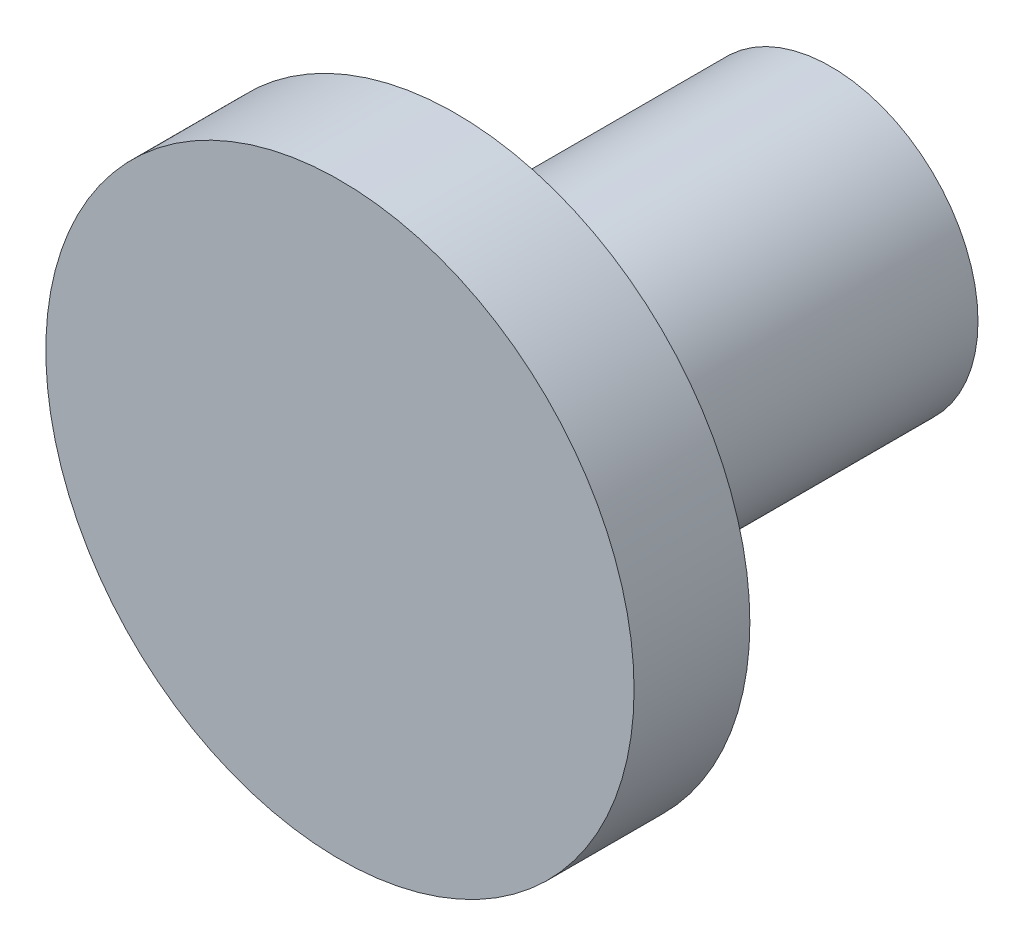
ISO-10303-21;
HEADER;
FILE_DESCRIPTION(('STEP AP214'),'2;1');
FILE_NAME('part.step','',(''),(''),'','','');
FILE_SCHEMA(('AUTOMOTIVE_DESIGN { 1 0 10303 214 1 1 1 1 }'));
ENDSEC;
DATA;
#1=APPLICATION_CONTEXT('core data for automotive mechanical design processes');
#2=APPLICATION_PROTOCOL_DEFINITION('international standard','automotive_design',2000,#1);
#3=PRODUCT_CONTEXT('',#1,'mechanical');
#4=PRODUCT('Part','Part','',(#3));
#5=PRODUCT_RELATED_PRODUCT_CATEGORY('part','',(#4));
#6=PRODUCT_DEFINITION_FORMATION('','',#4);
#7=PRODUCT_DEFINITION_CONTEXT('part definition',#1,'design');
#8=PRODUCT_DEFINITION('design','',#6,#7);
#9=PRODUCT_DEFINITION_SHAPE('','',#8);
#10=(LENGTH_UNIT() NAMED_UNIT(*) SI_UNIT(.MILLI.,.METRE.));
#11=(NAMED_UNIT(*) PLANE_ANGLE_UNIT() SI_UNIT($,.RADIAN.));
#12=(NAMED_UNIT(*) SI_UNIT($,.STERADIAN.) SOLID_ANGLE_UNIT());
#13=UNCERTAINTY_MEASURE_WITH_UNIT(LENGTH_MEASURE(1.E-05),#10,'distance_accuracy_value','');
#14=(GEOMETRIC_REPRESENTATION_CONTEXT(3) GLOBAL_UNCERTAINTY_ASSIGNED_CONTEXT((#13)) GLOBAL_UNIT_ASSIGNED_CONTEXT((#10,
#11,#12)) REPRESENTATION_CONTEXT('',''));
#15=CARTESIAN_POINT('',(0.,0.,0.));
#16=DIRECTION('',(0.,0.,1.));
#17=DIRECTION('',(1.,0.,0.));
#18=AXIS2_PLACEMENT_3D('',#15,#16,#17);
#19=CARTESIAN_POINT('',(0.,0.,5.));
#20=DIRECTION('',(0.,0.,-1.));
#21=DIRECTION('',(-1.,0.,0.));
#22=AXIS2_PLACEMENT_3D('',#19,#20,#21);
#23=CYLINDRICAL_SURFACE('',#22,12.7);
#24=CARTESIAN_POINT('',(0.,0.,5.));
#25=DIRECTION('',(0.,0.,1.));
#26=DIRECTION('',(1.,0.,0.));
#27=AXIS2_PLACEMENT_3D('',#24,#25,#26);
#28=CIRCLE('',#27,12.7);
#29=CARTESIAN_POINT('',(12.7,0.,5.));
#30=VERTEX_POINT('',#29);
#31=EDGE_CURVE('E37',#30,#30,#28,.T.);
#32=ORIENTED_EDGE('',*,*,#31,.F.);
#33=EDGE_LOOP('',(#32));
#34=FACE_BOUND('',#33,.T.);
#35=CARTESIAN_POINT('',(0.,0.,0.));
#36=DIRECTION('',(0.,0.,1.));
#37=DIRECTION('',(1.,0.,0.));
#38=AXIS2_PLACEMENT_3D('',#35,#36,#37);
#39=CIRCLE('',#38,12.7);
#40=CARTESIAN_POINT('',(12.7,0.,0.));
#41=VERTEX_POINT('',#40);
#42=EDGE_CURVE('E41',#41,#41,#39,.T.);
#43=ORIENTED_EDGE('',*,*,#42,.T.);
#44=EDGE_LOOP('',(#43));
#45=FACE_BOUND('',#44,.T.);
#46=ADVANCED_FACE('F31',(#34,#45),#23,.T.);
#47=CARTESIAN_POINT('',(0.,0.,5.));
#48=DIRECTION('',(0.,0.,1.));
#49=DIRECTION('',(1.,0.,0.));
#50=AXIS2_PLACEMENT_3D('',#47,#48,#49);
#51=PLANE('',#50);
#52=ORIENTED_EDGE('',*,*,#31,.T.);
#53=EDGE_LOOP('',(#52));
#54=FACE_BOUND('',#53,.T.);
#55=ADVANCED_FACE('F62',(#54),#51,.T.);
#56=CARTESIAN_POINT('',(0.,0.,0.));
#57=DIRECTION('',(0.,0.,1.));
#58=DIRECTION('',(1.,0.,0.));
#59=AXIS2_PLACEMENT_3D('',#56,#57,#58);
#60=PLANE('',#59);
#61=CARTESIAN_POINT('',(0.,0.,0.));
#62=DIRECTION('',(0.,0.,1.));
#63=DIRECTION('',(1.,0.,0.));
#64=AXIS2_PLACEMENT_3D('',#61,#62,#63);
#65=CIRCLE('',#64,6.35);
#66=CARTESIAN_POINT('',(6.35,0.,0.));
#67=VERTEX_POINT('',#66);
#68=EDGE_CURVE('E10',#67,#67,#65,.F.);
#69=ORIENTED_EDGE('',*,*,#68,.F.);
#70=EDGE_LOOP('',(#69));
#71=FACE_BOUND('',#70,.T.);
#72=ORIENTED_EDGE('',*,*,#42,.F.);
#73=EDGE_LOOP('',(#72));
#74=FACE_BOUND('',#73,.T.);
#75=ADVANCED_FACE('F55',(#71,#74),#60,.F.);
#76=CARTESIAN_POINT('',(0.,0.,-16.2));
#77=DIRECTION('',(0.,0.,1.));
#78=DIRECTION('',(1.,0.,0.));
#79=AXIS2_PLACEMENT_3D('',#76,#77,#78);
#80=CYLINDRICAL_SURFACE('',#79,6.35);
#81=CARTESIAN_POINT('',(0.,0.,-16.2));
#82=DIRECTION('',(0.,0.,-1.));
#83=DIRECTION('',(-1.,0.,0.));
#84=AXIS2_PLACEMENT_3D('',#81,#82,#83);
#85=CIRCLE('',#84,6.35);
#86=CARTESIAN_POINT('',(-6.35,0.,-16.2));
#87=VERTEX_POINT('',#86);
#88=EDGE_CURVE('E46',#87,#87,#85,.T.);
#89=ORIENTED_EDGE('',*,*,#88,.F.);
#90=EDGE_LOOP('',(#89));
#91=FACE_BOUND('',#90,.T.);
#92=ORIENTED_EDGE('',*,*,#68,.T.);
#93=EDGE_LOOP('',(#92));
#94=FACE_BOUND('',#93,.T.);
#95=ADVANCED_FACE('F53',(#91,#94),#80,.T.);
#96=CARTESIAN_POINT('',(0.,0.,-16.2));
#97=DIRECTION('',(0.,0.,-1.));
#98=DIRECTION('',(-1.,0.,0.));
#99=AXIS2_PLACEMENT_3D('',#96,#97,#98);
#100=PLANE('',#99);
#101=ORIENTED_EDGE('',*,*,#88,.T.);
#102=EDGE_LOOP('',(#101));
#103=FACE_BOUND('',#102,.T.);
#104=ADVANCED_FACE('F51',(#103),#100,.T.);
#105=CLOSED_SHELL('',(#46,#55,#75,#95,#104));
#106=MANIFOLD_SOLID_BREP('B2',#105);
#107=ADVANCED_BREP_SHAPE_REPRESENTATION('',(#18,#106),#14);
#108=SHAPE_DEFINITION_REPRESENTATION(#9,#107);
ENDSEC;
END-ISO-10303-21;
